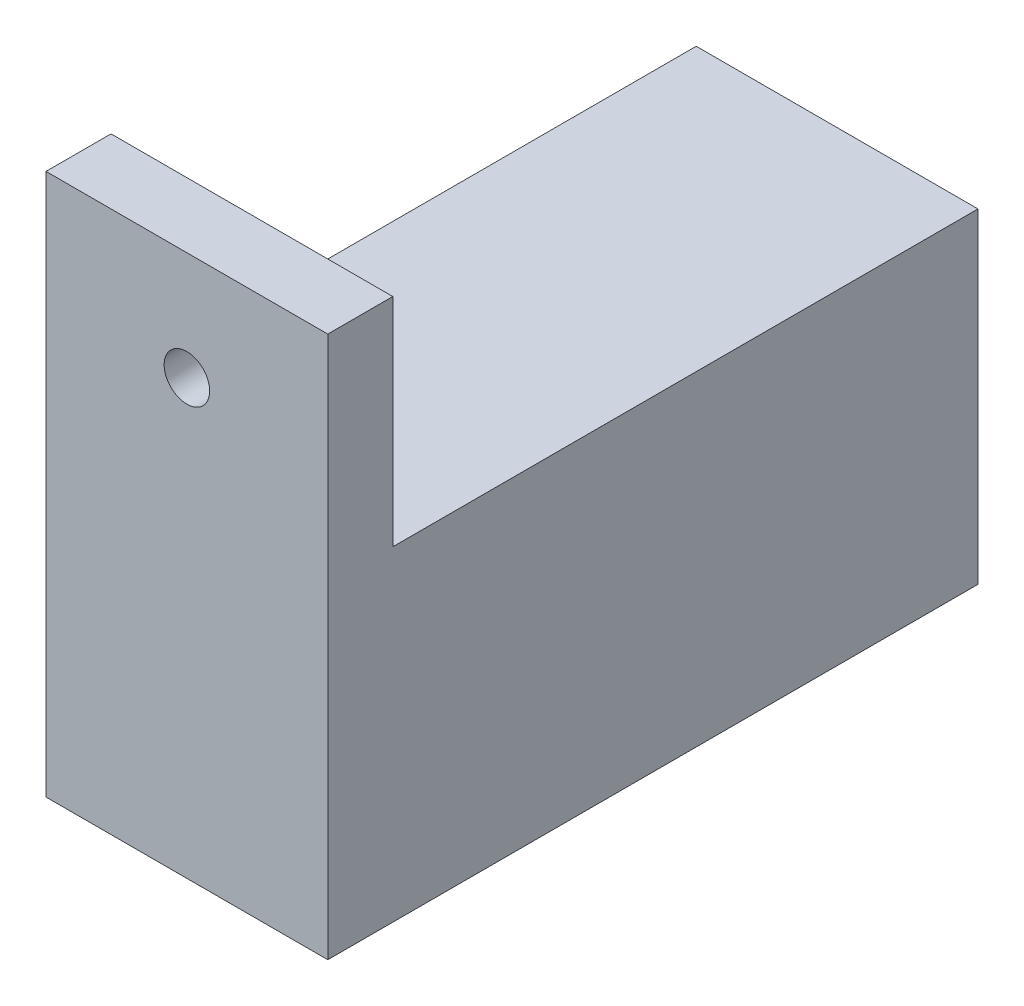
ISO-10303-21;
HEADER;
FILE_DESCRIPTION(('STEP AP214'),'2;1');
FILE_NAME('part.step','',(''),(''),'','','');
FILE_SCHEMA(('AUTOMOTIVE_DESIGN { 1 0 10303 214 1 1 1 1 }'));
ENDSEC;
DATA;
#1=APPLICATION_CONTEXT('core data for automotive mechanical design processes');
#2=APPLICATION_PROTOCOL_DEFINITION('international standard','automotive_design',2000,#1);
#3=PRODUCT_CONTEXT('',#1,'mechanical');
#4=PRODUCT('Part','Part','',(#3));
#5=PRODUCT_RELATED_PRODUCT_CATEGORY('part','',(#4));
#6=PRODUCT_DEFINITION_FORMATION('','',#4);
#7=PRODUCT_DEFINITION_CONTEXT('part definition',#1,'design');
#8=PRODUCT_DEFINITION('design','',#6,#7);
#9=PRODUCT_DEFINITION_SHAPE('','',#8);
#10=(LENGTH_UNIT() NAMED_UNIT(*) SI_UNIT(.MILLI.,.METRE.));
#11=(NAMED_UNIT(*) PLANE_ANGLE_UNIT() SI_UNIT($,.RADIAN.));
#12=(NAMED_UNIT(*) SI_UNIT($,.STERADIAN.) SOLID_ANGLE_UNIT());
#13=UNCERTAINTY_MEASURE_WITH_UNIT(LENGTH_MEASURE(1.E-05),#10,'distance_accuracy_value','');
#14=(GEOMETRIC_REPRESENTATION_CONTEXT(3) GLOBAL_UNCERTAINTY_ASSIGNED_CONTEXT((#13)) GLOBAL_UNIT_ASSIGNED_CONTEXT((#10,
#11,#12)) REPRESENTATION_CONTEXT('',''));
#15=CARTESIAN_POINT('',(0.,0.,0.));
#16=DIRECTION('',(0.,0.,1.));
#17=DIRECTION('',(1.,0.,0.));
#18=AXIS2_PLACEMENT_3D('',#15,#16,#17);
#19=CARTESIAN_POINT('',(-36.5058464494812,15.,-13.4820973740055));
#20=DIRECTION('',(1.,0.,0.));
#21=DIRECTION('',(0.,0.,-1.));
#22=AXIS2_PLACEMENT_3D('',#19,#20,#21);
#23=PLANE('',#22);
#24=DIRECTION('',(0.,0.,1.));
#25=VECTOR('',#24,1.);
#26=CARTESIAN_POINT('',(-36.5058464494812,0.,-13.4820973740055));
#27=LINE('',#26,#25);
#28=CARTESIAN_POINT('',(-36.5058464494812,0.,-13.4820973740055));
#29=VERTEX_POINT('',#28);
#30=CARTESIAN_POINT('',(-36.5058464494812,0.,16.5179026259945));
#31=VERTEX_POINT('',#30);
#32=EDGE_CURVE('E92',#29,#31,#27,.T.);
#33=ORIENTED_EDGE('',*,*,#32,.T.);
#34=DIRECTION('',(0.,-1.,0.));
#35=VECTOR('',#34,1.);
#36=CARTESIAN_POINT('',(-36.5058464494812,15.,16.5179026259945));
#37=LINE('',#36,#35);
#38=CARTESIAN_POINT('',(-36.5058464494812,25.,16.5179026259945));
#39=VERTEX_POINT('',#38);
#40=EDGE_CURVE('E11',#39,#31,#37,.T.);
#41=ORIENTED_EDGE('',*,*,#40,.F.);
#42=DIRECTION('',(0.,0.,1.));
#43=VECTOR('',#42,1.);
#44=CARTESIAN_POINT('',(-36.5058464494812,25.,16.5179026259945));
#45=LINE('',#44,#43);
#46=CARTESIAN_POINT('',(-36.5058464494812,25.,13.5179026259945));
#47=VERTEX_POINT('',#46);
#48=EDGE_CURVE('E129',#47,#39,#45,.T.);
#49=ORIENTED_EDGE('',*,*,#48,.F.);
#50=DIRECTION('',(0.,-1.,0.));
#51=VECTOR('',#50,1.);
#52=CARTESIAN_POINT('',(-36.5058464494812,25.,13.5179026259945));
#53=LINE('',#52,#51);
#54=CARTESIAN_POINT('',(-36.5058464494812,15.,13.5179026259945));
#55=VERTEX_POINT('',#54);
#56=EDGE_CURVE('E101',#47,#55,#53,.T.);
#57=ORIENTED_EDGE('',*,*,#56,.T.);
#58=DIRECTION('',(0.,0.,1.));
#59=VECTOR('',#58,1.);
#60=CARTESIAN_POINT('',(-36.5058464494812,15.,-13.4820973740055));
#61=LINE('',#60,#59);
#62=CARTESIAN_POINT('',(-36.5058464494812,15.,-13.4820973740055));
#63=VERTEX_POINT('',#62);
#64=EDGE_CURVE('E86',#63,#55,#61,.T.);
#65=ORIENTED_EDGE('',*,*,#64,.F.);
#66=DIRECTION('',(0.,-1.,0.));
#67=VECTOR('',#66,1.);
#68=CARTESIAN_POINT('',(-36.5058464494812,15.,-13.4820973740055));
#69=LINE('',#68,#67);
#70=EDGE_CURVE('E79',#63,#29,#69,.T.);
#71=ORIENTED_EDGE('',*,*,#70,.T.);
#72=EDGE_LOOP('',(#33,#41,#49,#57,#65,#71));
#73=FACE_BOUND('',#72,.T.);
#74=ADVANCED_FACE('F37',(#73),#23,.F.);
#75=CARTESIAN_POINT('',(-36.5058464494812,15.,16.5179026259945));
#76=DIRECTION('',(0.,0.,-1.));
#77=DIRECTION('',(-1.,0.,0.));
#78=AXIS2_PLACEMENT_3D('',#75,#76,#77);
#79=PLANE('',#78);
#80=CARTESIAN_POINT('',(-30.0058464494812,20.,16.5179026259945));
#81=DIRECTION('',(0.,0.,-1.));
#82=DIRECTION('',(-1.,0.,0.));
#83=AXIS2_PLACEMENT_3D('',#80,#81,#82);
#84=CIRCLE('',#83,1.05);
#85=CARTESIAN_POINT('',(-31.0558464494812,20.,16.5179026259945));
#86=VERTEX_POINT('',#85);
#87=EDGE_CURVE('E138',#86,#86,#84,.T.);
#88=ORIENTED_EDGE('',*,*,#87,.T.);
#89=EDGE_LOOP('',(#88));
#90=FACE_BOUND('',#89,.T.);
#91=DIRECTION('',(1.,0.,0.));
#92=VECTOR('',#91,1.);
#93=CARTESIAN_POINT('',(-36.5058464494812,0.,16.5179026259945));
#94=LINE('',#93,#92);
#95=CARTESIAN_POINT('',(-23.5058464494812,0.,16.5179026259945));
#96=VERTEX_POINT('',#95);
#97=EDGE_CURVE('E96',#31,#96,#94,.T.);
#98=ORIENTED_EDGE('',*,*,#97,.T.);
#99=DIRECTION('',(0.,-1.,0.));
#100=VECTOR('',#99,1.);
#101=CARTESIAN_POINT('',(-23.5058464494812,15.,16.5179026259945));
#102=LINE('',#101,#100);
#103=CARTESIAN_POINT('',(-23.5058464494812,25.,16.5179026259945));
#104=VERTEX_POINT('',#103);
#105=EDGE_CURVE('E44',#104,#96,#102,.T.);
#106=ORIENTED_EDGE('',*,*,#105,.F.);
#107=DIRECTION('',(1.,0.,0.));
#108=VECTOR('',#107,1.);
#109=CARTESIAN_POINT('',(-36.5058464494812,25.,16.5179026259945));
#110=LINE('',#109,#108);
#111=EDGE_CURVE('E121',#39,#104,#110,.T.);
#112=ORIENTED_EDGE('',*,*,#111,.F.);
#113=ORIENTED_EDGE('',*,*,#40,.T.);
#114=EDGE_LOOP('',(#98,#106,#112,#113));
#115=FACE_BOUND('',#114,.T.);
#116=ADVANCED_FACE('F119',(#90,#115),#79,.F.);
#117=CARTESIAN_POINT('',(-23.5058464494812,15.,-13.4820973740055));
#118=DIRECTION('',(-1.,0.,0.));
#119=DIRECTION('',(0.,0.,1.));
#120=AXIS2_PLACEMENT_3D('',#117,#118,#119);
#121=PLANE('',#120);
#122=DIRECTION('',(0.,0.,-1.));
#123=VECTOR('',#122,1.);
#124=CARTESIAN_POINT('',(-23.5058464494812,0.,-13.4820973740055));
#125=LINE('',#124,#123);
#126=CARTESIAN_POINT('',(-23.5058464494812,0.,-13.4820973740055));
#127=VERTEX_POINT('',#126);
#128=EDGE_CURVE('E87',#96,#127,#125,.T.);
#129=ORIENTED_EDGE('',*,*,#128,.T.);
#130=DIRECTION('',(0.,-1.,0.));
#131=VECTOR('',#130,1.);
#132=CARTESIAN_POINT('',(-23.5058464494812,15.,-13.4820973740055));
#133=LINE('',#132,#131);
#134=CARTESIAN_POINT('',(-23.5058464494812,15.,-13.4820973740055));
#135=VERTEX_POINT('',#134);
#136=EDGE_CURVE('E82',#135,#127,#133,.T.);
#137=ORIENTED_EDGE('',*,*,#136,.F.);
#138=DIRECTION('',(0.,0.,-1.));
#139=VECTOR('',#138,1.);
#140=CARTESIAN_POINT('',(-23.5058464494812,15.,-13.4820973740055));
#141=LINE('',#140,#139);
#142=CARTESIAN_POINT('',(-23.5058464494812,15.,13.5179026259945));
#143=VERTEX_POINT('',#142);
#144=EDGE_CURVE('E140',#143,#135,#141,.T.);
#145=ORIENTED_EDGE('',*,*,#144,.F.);
#146=DIRECTION('',(0.,-1.,0.));
#147=VECTOR('',#146,1.);
#148=CARTESIAN_POINT('',(-23.5058464494812,25.,13.5179026259945));
#149=LINE('',#148,#147);
#150=CARTESIAN_POINT('',(-23.5058464494812,25.,13.5179026259945));
#151=VERTEX_POINT('',#150);
#152=EDGE_CURVE('E97',#151,#143,#149,.T.);
#153=ORIENTED_EDGE('',*,*,#152,.F.);
#154=DIRECTION('',(0.,0.,-1.));
#155=VECTOR('',#154,1.);
#156=CARTESIAN_POINT('',(-23.5058464494812,25.,16.5179026259945));
#157=LINE('',#156,#155);
#158=EDGE_CURVE('E115',#104,#151,#157,.T.);
#159=ORIENTED_EDGE('',*,*,#158,.F.);
#160=ORIENTED_EDGE('',*,*,#105,.T.);
#161=EDGE_LOOP('',(#129,#137,#145,#153,#159,#160));
#162=FACE_BOUND('',#161,.T.);
#163=ADVANCED_FACE('F111',(#162),#121,.F.);
#164=CARTESIAN_POINT('',(-36.5058464494812,15.,-13.4820973740055));
#165=DIRECTION('',(0.,0.,1.));
#166=DIRECTION('',(1.,0.,0.));
#167=AXIS2_PLACEMENT_3D('',#164,#165,#166);
#168=PLANE('',#167);
#169=DIRECTION('',(-1.,0.,0.));
#170=VECTOR('',#169,1.);
#171=CARTESIAN_POINT('',(-36.5058464494812,0.,-13.4820973740055));
#172=LINE('',#171,#170);
#173=EDGE_CURVE('E76',#127,#29,#172,.T.);
#174=ORIENTED_EDGE('',*,*,#173,.T.);
#175=ORIENTED_EDGE('',*,*,#70,.F.);
#176=DIRECTION('',(-1.,0.,0.));
#177=VECTOR('',#176,1.);
#178=CARTESIAN_POINT('',(-36.5058464494812,15.,-13.4820973740055));
#179=LINE('',#178,#177);
#180=EDGE_CURVE('E57',#135,#63,#179,.T.);
#181=ORIENTED_EDGE('',*,*,#180,.F.);
#182=ORIENTED_EDGE('',*,*,#136,.T.);
#183=EDGE_LOOP('',(#174,#175,#181,#182));
#184=FACE_BOUND('',#183,.T.);
#185=ADVANCED_FACE('F78',(#184),#168,.F.);
#186=CARTESIAN_POINT('',(0.,15.,0.));
#187=DIRECTION('',(0.,1.,0.));
#188=DIRECTION('',(0.,0.,1.));
#189=AXIS2_PLACEMENT_3D('',#186,#187,#188);
#190=PLANE('',#189);
#191=DIRECTION('',(-1.,0.,0.));
#192=VECTOR('',#191,1.);
#193=CARTESIAN_POINT('',(-36.5058464494812,15.,13.5179026259945));
#194=LINE('',#193,#192);
#195=EDGE_CURVE('E51',#143,#55,#194,.T.);
#196=ORIENTED_EDGE('',*,*,#195,.F.);
#197=ORIENTED_EDGE('',*,*,#144,.T.);
#198=ORIENTED_EDGE('',*,*,#180,.T.);
#199=ORIENTED_EDGE('',*,*,#64,.T.);
#200=EDGE_LOOP('',(#196,#197,#198,#199));
#201=FACE_BOUND('',#200,.T.);
#202=ADVANCED_FACE('F141',(#201),#190,.T.);
#203=CARTESIAN_POINT('',(0.,0.,0.));
#204=DIRECTION('',(0.,1.,0.));
#205=DIRECTION('',(0.,0.,1.));
#206=AXIS2_PLACEMENT_3D('',#203,#204,#205);
#207=PLANE('',#206);
#208=ORIENTED_EDGE('',*,*,#32,.F.);
#209=ORIENTED_EDGE('',*,*,#173,.F.);
#210=ORIENTED_EDGE('',*,*,#128,.F.);
#211=ORIENTED_EDGE('',*,*,#97,.F.);
#212=EDGE_LOOP('',(#208,#209,#210,#211));
#213=FACE_BOUND('',#212,.T.);
#214=ADVANCED_FACE('F95',(#213),#207,.F.);
#215=CARTESIAN_POINT('',(-36.5058464494812,25.,13.5179026259945));
#216=DIRECTION('',(0.,0.,1.));
#217=DIRECTION('',(1.,0.,0.));
#218=AXIS2_PLACEMENT_3D('',#215,#216,#217);
#219=PLANE('',#218);
#220=CARTESIAN_POINT('',(-30.0058464494812,20.,13.5179026259945));
#221=DIRECTION('',(0.,0.,-1.));
#222=DIRECTION('',(-1.,0.,0.));
#223=AXIS2_PLACEMENT_3D('',#220,#221,#222);
#224=CIRCLE('',#223,1.05);
#225=CARTESIAN_POINT('',(-31.0558464494812,20.,13.5179026259945));
#226=VERTEX_POINT('',#225);
#227=EDGE_CURVE('E237',#226,#226,#224,.T.);
#228=ORIENTED_EDGE('',*,*,#227,.F.);
#229=EDGE_LOOP('',(#228));
#230=FACE_BOUND('',#229,.T.);
#231=ORIENTED_EDGE('',*,*,#195,.T.);
#232=ORIENTED_EDGE('',*,*,#56,.F.);
#233=DIRECTION('',(-1.,0.,0.));
#234=VECTOR('',#233,1.);
#235=CARTESIAN_POINT('',(-36.5058464494812,25.,13.5179026259945));
#236=LINE('',#235,#234);
#237=EDGE_CURVE('E131',#151,#47,#236,.T.);
#238=ORIENTED_EDGE('',*,*,#237,.F.);
#239=ORIENTED_EDGE('',*,*,#152,.T.);
#240=EDGE_LOOP('',(#231,#232,#238,#239));
#241=FACE_BOUND('',#240,.T.);
#242=ADVANCED_FACE('F144',(#230,#241),#219,.F.);
#243=CARTESIAN_POINT('',(0.,25.,0.));
#244=DIRECTION('',(0.,-1.,0.));
#245=DIRECTION('',(0.,0.,-1.));
#246=AXIS2_PLACEMENT_3D('',#243,#244,#245);
#247=PLANE('',#246);
#248=ORIENTED_EDGE('',*,*,#48,.T.);
#249=ORIENTED_EDGE('',*,*,#111,.T.);
#250=ORIENTED_EDGE('',*,*,#158,.T.);
#251=ORIENTED_EDGE('',*,*,#237,.T.);
#252=EDGE_LOOP('',(#248,#249,#250,#251));
#253=FACE_BOUND('',#252,.T.);
#254=ADVANCED_FACE('F126',(#253),#247,.F.);
#255=CARTESIAN_POINT('',(-30.0058464494812,20.,16.5179026259945));
#256=DIRECTION('',(0.,0.,-1.));
#257=DIRECTION('',(-1.,0.,0.));
#258=AXIS2_PLACEMENT_3D('',#255,#256,#257);
#259=CYLINDRICAL_SURFACE('',#258,1.05);
#260=ORIENTED_EDGE('',*,*,#87,.F.);
#261=EDGE_LOOP('',(#260));
#262=FACE_BOUND('',#261,.T.);
#263=ORIENTED_EDGE('',*,*,#227,.T.);
#264=EDGE_LOOP('',(#263));
#265=FACE_BOUND('',#264,.T.);
#266=ADVANCED_FACE('F157',(#262,#265),#259,.F.);
#267=CLOSED_SHELL('',(#74,#116,#163,#185,#202,#214,#242,#254,#266));
#268=MANIFOLD_SOLID_BREP('B2',#267);
#269=ADVANCED_BREP_SHAPE_REPRESENTATION('',(#18,#268),#14);
#270=SHAPE_DEFINITION_REPRESENTATION(#9,#269);
ENDSEC;
END-ISO-10303-21;
